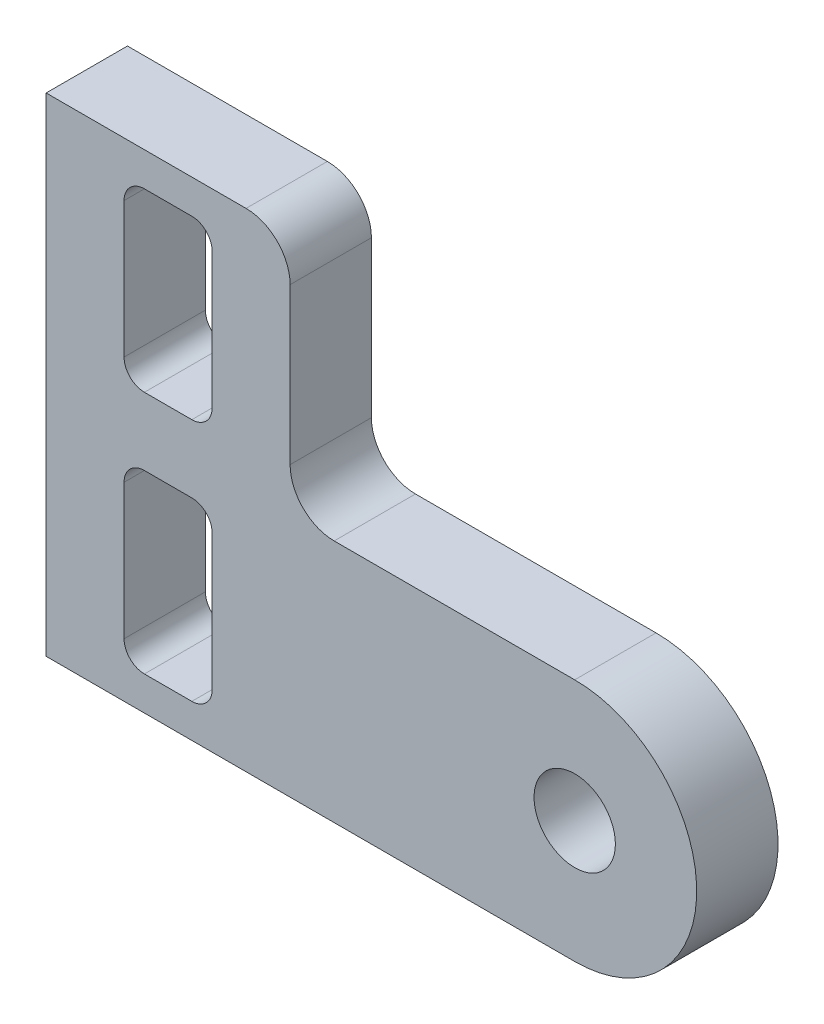
ISO-10303-21;
HEADER;
FILE_DESCRIPTION(('STEP AP214'),'2;1');
FILE_NAME('part.step','',(''),(''),'','','');
FILE_SCHEMA(('AUTOMOTIVE_DESIGN { 1 0 10303 214 1 1 1 1 }'));
ENDSEC;
DATA;
#1=APPLICATION_CONTEXT('core data for automotive mechanical design processes');
#2=APPLICATION_PROTOCOL_DEFINITION('international standard','automotive_design',2000,#1);
#3=PRODUCT_CONTEXT('',#1,'mechanical');
#4=PRODUCT('Part','Part','',(#3));
#5=PRODUCT_RELATED_PRODUCT_CATEGORY('part','',(#4));
#6=PRODUCT_DEFINITION_FORMATION('','',#4);
#7=PRODUCT_DEFINITION_CONTEXT('part definition',#1,'design');
#8=PRODUCT_DEFINITION('design','',#6,#7);
#9=PRODUCT_DEFINITION_SHAPE('','',#8);
#10=(LENGTH_UNIT() NAMED_UNIT(*) SI_UNIT(.MILLI.,.METRE.));
#11=(NAMED_UNIT(*) PLANE_ANGLE_UNIT() SI_UNIT($,.RADIAN.));
#12=(NAMED_UNIT(*) SI_UNIT($,.STERADIAN.) SOLID_ANGLE_UNIT());
#13=UNCERTAINTY_MEASURE_WITH_UNIT(LENGTH_MEASURE(1.E-05),#10,'distance_accuracy_value','');
#14=(GEOMETRIC_REPRESENTATION_CONTEXT(3) GLOBAL_UNCERTAINTY_ASSIGNED_CONTEXT((#13)) GLOBAL_UNIT_ASSIGNED_CONTEXT((#10,
#11,#12)) REPRESENTATION_CONTEXT('',''));
#15=CARTESIAN_POINT('',(0.,0.,0.));
#16=DIRECTION('',(0.,0.,1.));
#17=DIRECTION('',(1.,0.,0.));
#18=AXIS2_PLACEMENT_3D('',#15,#16,#17);
#19=CARTESIAN_POINT('',(201.0978533093,269.1465473352,3.));
#20=DIRECTION('',(0.,0.,1.));
#21=DIRECTION('',(1.,0.,0.));
#22=AXIS2_PLACEMENT_3D('',#19,#20,#21);
#23=PLANE('',#22);
#24=DIRECTION('',(1.,0.,0.));
#25=VECTOR('',#24,1.);
#26=CARTESIAN_POINT('',(185.2228533093,265.8965473352,3.));
#27=LINE('',#26,#25);
#28=CARTESIAN_POINT('',(185.2228533093,265.8965473352,3.));
#29=VERTEX_POINT('',#28);
#30=CARTESIAN_POINT('',(186.9728533093,265.8965473352,3.));
#31=VERTEX_POINT('',#30);
#32=EDGE_CURVE('E261',#29,#31,#27,.T.);
#33=ORIENTED_EDGE('',*,*,#32,.F.);
#34=CARTESIAN_POINT('',(185.2228533093,266.6465473352,3.));
#35=DIRECTION('',(0.,0.,1.));
#36=DIRECTION('',(1.,0.,0.));
#37=AXIS2_PLACEMENT_3D('',#34,#35,#36);
#38=CIRCLE('',#37,0.749999999999987);
#39=CARTESIAN_POINT('',(184.4728533093,266.6465473352,3.));
#40=VERTEX_POINT('',#39);
#41=EDGE_CURVE('E259',#40,#29,#38,.T.);
#42=ORIENTED_EDGE('',*,*,#41,.F.);
#43=DIRECTION('',(0.,-1.,0.));
#44=VECTOR('',#43,1.);
#45=CARTESIAN_POINT('',(184.4728533093,271.6465473352,3.));
#46=LINE('',#45,#44);
#47=CARTESIAN_POINT('',(184.4728533093,271.6465473352,3.));
#48=VERTEX_POINT('',#47);
#49=EDGE_CURVE('E275',#48,#40,#46,.T.);
#50=ORIENTED_EDGE('',*,*,#49,.F.);
#51=CARTESIAN_POINT('',(185.2228533093,271.6465473352,3.));
#52=DIRECTION('',(0.,0.,1.));
#53=DIRECTION('',(1.,0.,0.));
#54=AXIS2_PLACEMENT_3D('',#51,#52,#53);
#55=CIRCLE('',#54,0.750000000000015);
#56=CARTESIAN_POINT('',(185.2228533093,272.3965473352,3.));
#57=VERTEX_POINT('',#56);
#58=EDGE_CURVE('E272',#57,#48,#55,.T.);
#59=ORIENTED_EDGE('',*,*,#58,.F.);
#60=DIRECTION('',(-1.,0.,0.));
#61=VECTOR('',#60,1.);
#62=CARTESIAN_POINT('',(186.9728533093,272.3965473352,3.));
#63=LINE('',#62,#61);
#64=CARTESIAN_POINT('',(186.9728533093,272.3965473352,3.));
#65=VERTEX_POINT('',#64);
#66=EDGE_CURVE('E270',#65,#57,#63,.T.);
#67=ORIENTED_EDGE('',*,*,#66,.F.);
#68=CARTESIAN_POINT('',(186.9728533093,271.6465473352,3.));
#69=DIRECTION('',(0.,0.,1.));
#70=DIRECTION('',(1.,0.,0.));
#71=AXIS2_PLACEMENT_3D('',#68,#69,#70);
#72=CIRCLE('',#71,0.750000000000001);
#73=CARTESIAN_POINT('',(187.7228533093,271.6465473352,3.));
#74=VERTEX_POINT('',#73);
#75=EDGE_CURVE('E268',#74,#65,#72,.T.);
#76=ORIENTED_EDGE('',*,*,#75,.F.);
#77=DIRECTION('',(0.,1.,0.));
#78=VECTOR('',#77,1.);
#79=CARTESIAN_POINT('',(187.7228533093,266.6465473352,3.));
#80=LINE('',#79,#78);
#81=CARTESIAN_POINT('',(187.7228533093,266.6465473352,3.));
#82=VERTEX_POINT('',#81);
#83=EDGE_CURVE('E266',#82,#74,#80,.T.);
#84=ORIENTED_EDGE('',*,*,#83,.F.);
#85=CARTESIAN_POINT('',(186.9728533093,266.6465473352,3.));
#86=DIRECTION('',(0.,0.,1.));
#87=DIRECTION('',(1.,0.,0.));
#88=AXIS2_PLACEMENT_3D('',#85,#86,#87);
#89=CIRCLE('',#88,0.749999999999973);
#90=EDGE_CURVE('E264',#31,#82,#89,.T.);
#91=ORIENTED_EDGE('',*,*,#90,.F.);
#92=EDGE_LOOP('',(#33,#42,#50,#59,#67,#76,#84,#91));
#93=FACE_BOUND('',#92,.T.);
#94=CARTESIAN_POINT('',(201.0978533093,269.1465473352,3.));
#95=DIRECTION('',(0.,0.,1.));
#96=DIRECTION('',(1.,0.,0.));
#97=AXIS2_PLACEMENT_3D('',#94,#95,#96);
#98=CIRCLE('',#97,4.49999999999998);
#99=CARTESIAN_POINT('',(201.0978533093,264.6465473352,3.));
#100=VERTEX_POINT('',#99);
#101=CARTESIAN_POINT('',(201.0978533093,273.6465473352,3.));
#102=VERTEX_POINT('',#101);
#103=EDGE_CURVE('E324',#100,#102,#98,.T.);
#104=ORIENTED_EDGE('',*,*,#103,.T.);
#105=DIRECTION('',(-1.,0.,0.));
#106=VECTOR('',#105,1.);
#107=CARTESIAN_POINT('',(201.0978533093,273.6465473352,3.));
#108=LINE('',#107,#106);
#109=CARTESIAN_POINT('',(192.2228533093,273.6465473352,3.));
#110=VERTEX_POINT('',#109);
#111=EDGE_CURVE('E327',#102,#110,#108,.T.);
#112=ORIENTED_EDGE('',*,*,#111,.T.);
#113=CARTESIAN_POINT('',(192.2228533093,275.2715473352,3.));
#114=DIRECTION('',(0.,0.,-1.));
#115=DIRECTION('',(1.,0.,0.));
#116=AXIS2_PLACEMENT_3D('',#113,#114,#115);
#117=CIRCLE('',#116,1.62500000000002);
#118=CARTESIAN_POINT('',(190.5978533093,275.2715473352,3.));
#119=VERTEX_POINT('',#118);
#120=EDGE_CURVE('E330',#110,#119,#117,.T.);
#121=ORIENTED_EDGE('',*,*,#120,.T.);
#122=DIRECTION('',(0.,1.,0.));
#123=VECTOR('',#122,1.);
#124=CARTESIAN_POINT('',(190.5978533093,281.0215473352,3.));
#125=LINE('',#124,#123);
#126=CARTESIAN_POINT('',(190.5978533093,281.0215473352,3.));
#127=VERTEX_POINT('',#126);
#128=EDGE_CURVE('E332',#119,#127,#125,.T.);
#129=ORIENTED_EDGE('',*,*,#128,.T.);
#130=CARTESIAN_POINT('',(188.9728533093,281.0215473352,3.));
#131=DIRECTION('',(0.,0.,1.));
#132=DIRECTION('',(1.,0.,0.));
#133=AXIS2_PLACEMENT_3D('',#130,#131,#132);
#134=CIRCLE('',#133,1.625);
#135=CARTESIAN_POINT('',(188.9728533093,282.6465473352,3.));
#136=VERTEX_POINT('',#135);
#137=EDGE_CURVE('E334',#127,#136,#134,.T.);
#138=ORIENTED_EDGE('',*,*,#137,.T.);
#139=DIRECTION('',(-1.,0.,0.));
#140=VECTOR('',#139,1.);
#141=CARTESIAN_POINT('',(188.9728533093,282.6465473352,3.));
#142=LINE('',#141,#140);
#143=CARTESIAN_POINT('',(181.5978533093,282.6465473352,3.));
#144=VERTEX_POINT('',#143);
#145=EDGE_CURVE('E336',#136,#144,#142,.T.);
#146=ORIENTED_EDGE('',*,*,#145,.T.);
#147=DIRECTION('',(0.,-1.,0.));
#148=VECTOR('',#147,1.);
#149=CARTESIAN_POINT('',(181.5978533093,282.6465473352,3.));
#150=LINE('',#149,#148);
#151=CARTESIAN_POINT('',(181.5978533093,264.6465473352,3.));
#152=VERTEX_POINT('',#151);
#153=EDGE_CURVE('E338',#144,#152,#150,.T.);
#154=ORIENTED_EDGE('',*,*,#153,.T.);
#155=DIRECTION('',(1.,0.,0.));
#156=VECTOR('',#155,1.);
#157=CARTESIAN_POINT('',(201.0978533093,264.6465473352,3.));
#158=LINE('',#157,#156);
#159=EDGE_CURVE('E340',#152,#100,#158,.T.);
#160=ORIENTED_EDGE('',*,*,#159,.T.);
#161=EDGE_LOOP('',(#104,#112,#121,#129,#138,#146,#154,#160));
#162=FACE_BOUND('',#161,.T.);
#163=CARTESIAN_POINT('',(201.0978533093,269.1465473352,3.));
#164=DIRECTION('',(0.,0.,1.));
#165=DIRECTION('',(1.,0.,0.));
#166=AXIS2_PLACEMENT_3D('',#163,#164,#165);
#167=CIRCLE('',#166,1.5);
#168=CARTESIAN_POINT('',(202.5978533093,269.1465473352,3.));
#169=VERTEX_POINT('',#168);
#170=EDGE_CURVE('E318',#169,#169,#167,.T.);
#171=ORIENTED_EDGE('',*,*,#170,.F.);
#172=EDGE_LOOP('',(#171));
#173=FACE_BOUND('',#172,.T.);
#174=DIRECTION('',(1.,0.,0.));
#175=VECTOR('',#174,1.);
#176=CARTESIAN_POINT('',(185.2228533093,274.8959687639,3.));
#177=LINE('',#176,#175);
#178=CARTESIAN_POINT('',(185.2228533093,274.8959687639,3.));
#179=VERTEX_POINT('',#178);
#180=CARTESIAN_POINT('',(186.9728533093,274.8959687639,3.));
#181=VERTEX_POINT('',#180);
#182=EDGE_CURVE('E202',#179,#181,#177,.T.);
#183=ORIENTED_EDGE('',*,*,#182,.F.);
#184=CARTESIAN_POINT('',(185.2228533093,275.6459687639,3.));
#185=DIRECTION('',(0.,0.,1.));
#186=DIRECTION('',(1.,0.,0.));
#187=AXIS2_PLACEMENT_3D('',#184,#185,#186);
#188=CIRCLE('',#187,0.750000000000015);
#189=CARTESIAN_POINT('',(184.4728533093,275.6459687639,3.));
#190=VERTEX_POINT('',#189);
#191=EDGE_CURVE('E194',#190,#179,#188,.T.);
#192=ORIENTED_EDGE('',*,*,#191,.F.);
#193=DIRECTION('',(0.,-1.,0.));
#194=VECTOR('',#193,1.);
#195=CARTESIAN_POINT('',(184.4728533093,280.6459687639,3.));
#196=LINE('',#195,#194);
#197=CARTESIAN_POINT('',(184.4728533093,280.6459687639,3.));
#198=VERTEX_POINT('',#197);
#199=EDGE_CURVE('E227',#198,#190,#196,.T.);
#200=ORIENTED_EDGE('',*,*,#199,.F.);
#201=CARTESIAN_POINT('',(185.2228533093,280.6459687639,3.));
#202=DIRECTION('',(0.,0.,1.));
#203=DIRECTION('',(1.,0.,0.));
#204=AXIS2_PLACEMENT_3D('',#201,#202,#203);
#205=CIRCLE('',#204,0.750000000000015);
#206=CARTESIAN_POINT('',(185.2228533093,281.3959687639,3.));
#207=VERTEX_POINT('',#206);
#208=EDGE_CURVE('E225',#207,#198,#205,.T.);
#209=ORIENTED_EDGE('',*,*,#208,.F.);
#210=DIRECTION('',(-1.,0.,0.));
#211=VECTOR('',#210,1.);
#212=CARTESIAN_POINT('',(186.9728533093,281.3959687639,3.));
#213=LINE('',#212,#211);
#214=CARTESIAN_POINT('',(186.9728533093,281.3959687639,3.));
#215=VERTEX_POINT('',#214);
#216=EDGE_CURVE('E223',#215,#207,#213,.T.);
#217=ORIENTED_EDGE('',*,*,#216,.F.);
#218=CARTESIAN_POINT('',(186.9728533093,280.6459687639,3.));
#219=DIRECTION('',(0.,0.,1.));
#220=DIRECTION('',(1.,0.,0.));
#221=AXIS2_PLACEMENT_3D('',#218,#219,#220);
#222=CIRCLE('',#221,0.750000000000001);
#223=CARTESIAN_POINT('',(187.7228533093,280.6459687639,3.));
#224=VERTEX_POINT('',#223);
#225=EDGE_CURVE('E221',#224,#215,#222,.T.);
#226=ORIENTED_EDGE('',*,*,#225,.F.);
#227=DIRECTION('',(0.,1.,0.));
#228=VECTOR('',#227,1.);
#229=CARTESIAN_POINT('',(187.7228533093,275.6459687639,3.));
#230=LINE('',#229,#228);
#231=CARTESIAN_POINT('',(187.7228533093,275.6459687639,3.));
#232=VERTEX_POINT('',#231);
#233=EDGE_CURVE('E217',#232,#224,#230,.T.);
#234=ORIENTED_EDGE('',*,*,#233,.F.);
#235=CARTESIAN_POINT('',(186.9728533093,275.6459687639,3.));
#236=DIRECTION('',(0.,0.,1.));
#237=DIRECTION('',(1.,0.,0.));
#238=AXIS2_PLACEMENT_3D('',#235,#236,#237);
#239=CIRCLE('',#238,0.750000000000001);
#240=EDGE_CURVE('E215',#181,#232,#239,.T.);
#241=ORIENTED_EDGE('',*,*,#240,.F.);
#242=EDGE_LOOP('',(#183,#192,#200,#209,#217,#226,#234,#241));
#243=FACE_BOUND('',#242,.T.);
#244=ADVANCED_FACE('F33',(#93,#162,#173,#243),#23,.T.);
#245=CARTESIAN_POINT('',(201.0978533093,269.1465473352,0.));
#246=DIRECTION('',(0.,0.,1.));
#247=DIRECTION('',(1.,0.,0.));
#248=AXIS2_PLACEMENT_3D('',#245,#246,#247);
#249=PLANE('',#248);
#250=CARTESIAN_POINT('',(185.2228533093,266.6465473352,0.));
#251=DIRECTION('',(0.,0.,1.));
#252=DIRECTION('',(1.,0.,0.));
#253=AXIS2_PLACEMENT_3D('',#250,#251,#252);
#254=CIRCLE('',#253,0.749999999999987);
#255=CARTESIAN_POINT('',(184.4728533093,266.6465473352,0.));
#256=VERTEX_POINT('',#255);
#257=CARTESIAN_POINT('',(185.2228533093,265.8965473352,0.));
#258=VERTEX_POINT('',#257);
#259=EDGE_CURVE('E210',#256,#258,#254,.T.);
#260=ORIENTED_EDGE('',*,*,#259,.T.);
#261=DIRECTION('',(1.,0.,0.));
#262=VECTOR('',#261,1.);
#263=CARTESIAN_POINT('',(185.2228533093,265.8965473352,0.));
#264=LINE('',#263,#262);
#265=CARTESIAN_POINT('',(186.9728533093,265.8965473352,0.));
#266=VERTEX_POINT('',#265);
#267=EDGE_CURVE('E280',#258,#266,#264,.T.);
#268=ORIENTED_EDGE('',*,*,#267,.T.);
#269=CARTESIAN_POINT('',(186.9728533093,266.6465473352,0.));
#270=DIRECTION('',(0.,0.,1.));
#271=DIRECTION('',(1.,0.,0.));
#272=AXIS2_PLACEMENT_3D('',#269,#270,#271);
#273=CIRCLE('',#272,0.749999999999973);
#274=CARTESIAN_POINT('',(187.7228533093,266.6465473352,0.));
#275=VERTEX_POINT('',#274);
#276=EDGE_CURVE('E283',#266,#275,#273,.T.);
#277=ORIENTED_EDGE('',*,*,#276,.T.);
#278=DIRECTION('',(0.,1.,0.));
#279=VECTOR('',#278,1.);
#280=CARTESIAN_POINT('',(187.7228533093,266.6465473352,0.));
#281=LINE('',#280,#279);
#282=CARTESIAN_POINT('',(187.7228533093,271.6465473352,0.));
#283=VERTEX_POINT('',#282);
#284=EDGE_CURVE('E286',#275,#283,#281,.T.);
#285=ORIENTED_EDGE('',*,*,#284,.T.);
#286=CARTESIAN_POINT('',(186.9728533093,271.6465473352,0.));
#287=DIRECTION('',(0.,0.,1.));
#288=DIRECTION('',(1.,0.,0.));
#289=AXIS2_PLACEMENT_3D('',#286,#287,#288);
#290=CIRCLE('',#289,0.750000000000001);
#291=CARTESIAN_POINT('',(186.9728533093,272.3965473352,0.));
#292=VERTEX_POINT('',#291);
#293=EDGE_CURVE('E289',#283,#292,#290,.T.);
#294=ORIENTED_EDGE('',*,*,#293,.T.);
#295=DIRECTION('',(-1.,0.,0.));
#296=VECTOR('',#295,1.);
#297=CARTESIAN_POINT('',(186.9728533093,272.3965473352,0.));
#298=LINE('',#297,#296);
#299=CARTESIAN_POINT('',(185.2228533093,272.3965473352,0.));
#300=VERTEX_POINT('',#299);
#301=EDGE_CURVE('E292',#292,#300,#298,.T.);
#302=ORIENTED_EDGE('',*,*,#301,.T.);
#303=CARTESIAN_POINT('',(185.2228533093,271.6465473352,0.));
#304=DIRECTION('',(0.,0.,1.));
#305=DIRECTION('',(1.,0.,0.));
#306=AXIS2_PLACEMENT_3D('',#303,#304,#305);
#307=CIRCLE('',#306,0.750000000000015);
#308=CARTESIAN_POINT('',(184.4728533093,271.6465473352,0.));
#309=VERTEX_POINT('',#308);
#310=EDGE_CURVE('E295',#300,#309,#307,.T.);
#311=ORIENTED_EDGE('',*,*,#310,.T.);
#312=DIRECTION('',(0.,-1.,0.));
#313=VECTOR('',#312,1.);
#314=CARTESIAN_POINT('',(184.4728533093,271.6465473352,0.));
#315=LINE('',#314,#313);
#316=EDGE_CURVE('E262',#309,#256,#315,.T.);
#317=ORIENTED_EDGE('',*,*,#316,.T.);
#318=EDGE_LOOP('',(#260,#268,#277,#285,#294,#302,#311,#317));
#319=FACE_BOUND('',#318,.T.);
#320=CARTESIAN_POINT('',(201.0978533093,269.1465473352,0.));
#321=DIRECTION('',(0.,0.,1.));
#322=DIRECTION('',(1.,0.,0.));
#323=AXIS2_PLACEMENT_3D('',#320,#321,#322);
#324=CIRCLE('',#323,4.49999999999998);
#325=CARTESIAN_POINT('',(201.0978533093,264.6465473352,0.));
#326=VERTEX_POINT('',#325);
#327=CARTESIAN_POINT('',(201.0978533093,273.6465473352,0.));
#328=VERTEX_POINT('',#327);
#329=EDGE_CURVE('E321',#326,#328,#324,.T.);
#330=ORIENTED_EDGE('',*,*,#329,.F.);
#331=DIRECTION('',(1.,0.,0.));
#332=VECTOR('',#331,1.);
#333=CARTESIAN_POINT('',(201.0978533093,264.6465473352,0.));
#334=LINE('',#333,#332);
#335=CARTESIAN_POINT('',(181.5978533093,264.6465473352,0.));
#336=VERTEX_POINT('',#335);
#337=EDGE_CURVE('E328',#336,#326,#334,.T.);
#338=ORIENTED_EDGE('',*,*,#337,.F.);
#339=DIRECTION('',(0.,-1.,0.));
#340=VECTOR('',#339,1.);
#341=CARTESIAN_POINT('',(181.5978533093,282.6465473352,0.));
#342=LINE('',#341,#340);
#343=CARTESIAN_POINT('',(181.5978533093,282.6465473352,0.));
#344=VERTEX_POINT('',#343);
#345=EDGE_CURVE('E355',#344,#336,#342,.T.);
#346=ORIENTED_EDGE('',*,*,#345,.F.);
#347=DIRECTION('',(-1.,0.,0.));
#348=VECTOR('',#347,1.);
#349=CARTESIAN_POINT('',(188.9728533093,282.6465473352,0.));
#350=LINE('',#349,#348);
#351=CARTESIAN_POINT('',(188.9728533093,282.6465473352,0.));
#352=VERTEX_POINT('',#351);
#353=EDGE_CURVE('E353',#352,#344,#350,.T.);
#354=ORIENTED_EDGE('',*,*,#353,.F.);
#355=CARTESIAN_POINT('',(188.9728533093,281.0215473352,0.));
#356=DIRECTION('',(0.,0.,1.));
#357=DIRECTION('',(1.,0.,0.));
#358=AXIS2_PLACEMENT_3D('',#355,#356,#357);
#359=CIRCLE('',#358,1.625);
#360=CARTESIAN_POINT('',(190.5978533093,281.0215473352,0.));
#361=VERTEX_POINT('',#360);
#362=EDGE_CURVE('E351',#361,#352,#359,.T.);
#363=ORIENTED_EDGE('',*,*,#362,.F.);
#364=DIRECTION('',(0.,1.,0.));
#365=VECTOR('',#364,1.);
#366=CARTESIAN_POINT('',(190.5978533093,281.0215473352,0.));
#367=LINE('',#366,#365);
#368=CARTESIAN_POINT('',(190.5978533093,275.2715473352,0.));
#369=VERTEX_POINT('',#368);
#370=EDGE_CURVE('E349',#369,#361,#367,.T.);
#371=ORIENTED_EDGE('',*,*,#370,.F.);
#372=CARTESIAN_POINT('',(192.2228533093,275.2715473352,0.));
#373=DIRECTION('',(0.,0.,-1.));
#374=DIRECTION('',(1.,0.,0.));
#375=AXIS2_PLACEMENT_3D('',#372,#373,#374);
#376=CIRCLE('',#375,1.62500000000002);
#377=CARTESIAN_POINT('',(192.2228533093,273.6465473352,0.));
#378=VERTEX_POINT('',#377);
#379=EDGE_CURVE('E347',#378,#369,#376,.T.);
#380=ORIENTED_EDGE('',*,*,#379,.F.);
#381=DIRECTION('',(-1.,0.,0.));
#382=VECTOR('',#381,1.);
#383=CARTESIAN_POINT('',(201.0978533093,273.6465473352,0.));
#384=LINE('',#383,#382);
#385=EDGE_CURVE('E345',#328,#378,#384,.T.);
#386=ORIENTED_EDGE('',*,*,#385,.F.);
#387=EDGE_LOOP('',(#330,#338,#346,#354,#363,#371,#380,#386));
#388=FACE_BOUND('',#387,.T.);
#389=CARTESIAN_POINT('',(201.0978533093,269.1465473352,0.));
#390=DIRECTION('',(0.,0.,1.));
#391=DIRECTION('',(1.,0.,0.));
#392=AXIS2_PLACEMENT_3D('',#389,#390,#391);
#393=CIRCLE('',#392,1.5);
#394=CARTESIAN_POINT('',(202.5978533093,269.1465473352,0.));
#395=VERTEX_POINT('',#394);
#396=EDGE_CURVE('E317',#395,#395,#393,.T.);
#397=ORIENTED_EDGE('',*,*,#396,.T.);
#398=EDGE_LOOP('',(#397));
#399=FACE_BOUND('',#398,.T.);
#400=CARTESIAN_POINT('',(185.2228533093,275.6459687639,0.));
#401=DIRECTION('',(0.,0.,1.));
#402=DIRECTION('',(1.,0.,0.));
#403=AXIS2_PLACEMENT_3D('',#400,#401,#402);
#404=CIRCLE('',#403,0.750000000000015);
#405=CARTESIAN_POINT('',(184.4728533093,275.6459687639,0.));
#406=VERTEX_POINT('',#405);
#407=CARTESIAN_POINT('',(185.2228533093,274.8959687639,0.));
#408=VERTEX_POINT('',#407);
#409=EDGE_CURVE('E56',#406,#408,#404,.T.);
#410=ORIENTED_EDGE('',*,*,#409,.T.);
#411=DIRECTION('',(1.,0.,0.));
#412=VECTOR('',#411,1.);
#413=CARTESIAN_POINT('',(185.2228533093,274.8959687639,0.));
#414=LINE('',#413,#412);
#415=CARTESIAN_POINT('',(186.9728533093,274.8959687639,0.));
#416=VERTEX_POINT('',#415);
#417=EDGE_CURVE('E209',#408,#416,#414,.T.);
#418=ORIENTED_EDGE('',*,*,#417,.T.);
#419=CARTESIAN_POINT('',(186.9728533093,275.6459687639,0.));
#420=DIRECTION('',(0.,0.,1.));
#421=DIRECTION('',(1.,0.,0.));
#422=AXIS2_PLACEMENT_3D('',#419,#420,#421);
#423=CIRCLE('',#422,0.750000000000001);
#424=CARTESIAN_POINT('',(187.7228533093,275.6459687639,0.));
#425=VERTEX_POINT('',#424);
#426=EDGE_CURVE('E231',#416,#425,#423,.T.);
#427=ORIENTED_EDGE('',*,*,#426,.T.);
#428=DIRECTION('',(0.,1.,0.));
#429=VECTOR('',#428,1.);
#430=CARTESIAN_POINT('',(187.7228533093,275.6459687639,0.));
#431=LINE('',#430,#429);
#432=CARTESIAN_POINT('',(187.7228533093,280.6459687639,0.));
#433=VERTEX_POINT('',#432);
#434=EDGE_CURVE('E234',#425,#433,#431,.T.);
#435=ORIENTED_EDGE('',*,*,#434,.T.);
#436=CARTESIAN_POINT('',(186.9728533093,280.6459687639,0.));
#437=DIRECTION('',(0.,0.,1.));
#438=DIRECTION('',(1.,0.,0.));
#439=AXIS2_PLACEMENT_3D('',#436,#437,#438);
#440=CIRCLE('',#439,0.750000000000001);
#441=CARTESIAN_POINT('',(186.9728533093,281.3959687639,0.));
#442=VERTEX_POINT('',#441);
#443=EDGE_CURVE('E237',#433,#442,#440,.T.);
#444=ORIENTED_EDGE('',*,*,#443,.T.);
#445=DIRECTION('',(-1.,0.,0.));
#446=VECTOR('',#445,1.);
#447=CARTESIAN_POINT('',(186.9728533093,281.3959687639,0.));
#448=LINE('',#447,#446);
#449=CARTESIAN_POINT('',(185.2228533093,281.3959687639,0.));
#450=VERTEX_POINT('',#449);
#451=EDGE_CURVE('E240',#442,#450,#448,.T.);
#452=ORIENTED_EDGE('',*,*,#451,.T.);
#453=CARTESIAN_POINT('',(185.2228533093,280.6459687639,0.));
#454=DIRECTION('',(0.,0.,1.));
#455=DIRECTION('',(1.,0.,0.));
#456=AXIS2_PLACEMENT_3D('',#453,#454,#455);
#457=CIRCLE('',#456,0.750000000000015);
#458=CARTESIAN_POINT('',(184.4728533093,280.6459687639,0.));
#459=VERTEX_POINT('',#458);
#460=EDGE_CURVE('E243',#450,#459,#457,.T.);
#461=ORIENTED_EDGE('',*,*,#460,.T.);
#462=DIRECTION('',(0.,-1.,0.));
#463=VECTOR('',#462,1.);
#464=CARTESIAN_POINT('',(184.4728533093,280.6459687639,0.));
#465=LINE('',#464,#463);
#466=EDGE_CURVE('E203',#459,#406,#465,.T.);
#467=ORIENTED_EDGE('',*,*,#466,.T.);
#468=EDGE_LOOP('',(#410,#418,#427,#435,#444,#452,#461,#467));
#469=FACE_BOUND('',#468,.T.);
#470=ADVANCED_FACE('F385',(#319,#388,#399,#469),#249,.F.);
#471=CARTESIAN_POINT('',(201.0978533093,269.1465473352,3.));
#472=DIRECTION('',(0.,0.,-1.));
#473=DIRECTION('',(-1.,0.,0.));
#474=AXIS2_PLACEMENT_3D('',#471,#472,#473);
#475=CYLINDRICAL_SURFACE('',#474,4.49999999999998);
#476=ORIENTED_EDGE('',*,*,#329,.T.);
#477=DIRECTION('',(0.,0.,-1.));
#478=VECTOR('',#477,1.);
#479=CARTESIAN_POINT('',(201.0978533093,273.6465473352,3.));
#480=LINE('',#479,#478);
#481=EDGE_CURVE('E11',#102,#328,#480,.T.);
#482=ORIENTED_EDGE('',*,*,#481,.F.);
#483=ORIENTED_EDGE('',*,*,#103,.F.);
#484=DIRECTION('',(0.,0.,-1.));
#485=VECTOR('',#484,1.);
#486=CARTESIAN_POINT('',(201.0978533093,264.6465473352,3.));
#487=LINE('',#486,#485);
#488=EDGE_CURVE('E342',#100,#326,#487,.T.);
#489=ORIENTED_EDGE('',*,*,#488,.T.);
#490=EDGE_LOOP('',(#476,#482,#483,#489));
#491=FACE_BOUND('',#490,.T.);
#492=ADVANCED_FACE('F35',(#491),#475,.T.);
#493=CARTESIAN_POINT('',(201.0978533093,273.6465473352,3.));
#494=DIRECTION('',(0.,-1.,0.));
#495=DIRECTION('',(0.,0.,-1.));
#496=AXIS2_PLACEMENT_3D('',#493,#494,#495);
#497=PLANE('',#496);
#498=ORIENTED_EDGE('',*,*,#385,.T.);
#499=DIRECTION('',(0.,0.,-1.));
#500=VECTOR('',#499,1.);
#501=CARTESIAN_POINT('',(192.2228533093,273.6465473352,3.));
#502=LINE('',#501,#500);
#503=EDGE_CURVE('E41',#110,#378,#502,.T.);
#504=ORIENTED_EDGE('',*,*,#503,.F.);
#505=ORIENTED_EDGE('',*,*,#111,.F.);
#506=ORIENTED_EDGE('',*,*,#481,.T.);
#507=EDGE_LOOP('',(#498,#504,#505,#506));
#508=FACE_BOUND('',#507,.T.);
#509=ADVANCED_FACE('F403',(#508),#497,.F.);
#510=CARTESIAN_POINT('',(192.2228533093,275.2715473352,3.));
#511=DIRECTION('',(0.,0.,-1.));
#512=DIRECTION('',(-1.,0.,0.));
#513=AXIS2_PLACEMENT_3D('',#510,#511,#512);
#514=CYLINDRICAL_SURFACE('',#513,1.62500000000002);
#515=ORIENTED_EDGE('',*,*,#379,.T.);
#516=DIRECTION('',(0.,0.,-1.));
#517=VECTOR('',#516,1.);
#518=CARTESIAN_POINT('',(190.5978533093,275.2715473352,3.));
#519=LINE('',#518,#517);
#520=EDGE_CURVE('E372',#119,#369,#519,.T.);
#521=ORIENTED_EDGE('',*,*,#520,.F.);
#522=ORIENTED_EDGE('',*,*,#120,.F.);
#523=ORIENTED_EDGE('',*,*,#503,.T.);
#524=EDGE_LOOP('',(#515,#521,#522,#523));
#525=FACE_BOUND('',#524,.T.);
#526=ADVANCED_FACE('F379',(#525),#514,.F.);
#527=CARTESIAN_POINT('',(190.5978533093,281.0215473352,3.));
#528=DIRECTION('',(-1.,0.,0.));
#529=DIRECTION('',(0.,0.,1.));
#530=AXIS2_PLACEMENT_3D('',#527,#528,#529);
#531=PLANE('',#530);
#532=ORIENTED_EDGE('',*,*,#370,.T.);
#533=DIRECTION('',(0.,0.,-1.));
#534=VECTOR('',#533,1.);
#535=CARTESIAN_POINT('',(190.5978533093,281.0215473352,3.));
#536=LINE('',#535,#534);
#537=EDGE_CURVE('E369',#127,#361,#536,.T.);
#538=ORIENTED_EDGE('',*,*,#537,.F.);
#539=ORIENTED_EDGE('',*,*,#128,.F.);
#540=ORIENTED_EDGE('',*,*,#520,.T.);
#541=EDGE_LOOP('',(#532,#538,#539,#540));
#542=FACE_BOUND('',#541,.T.);
#543=ADVANCED_FACE('F391',(#542),#531,.F.);
#544=CARTESIAN_POINT('',(188.9728533093,281.0215473352,3.));
#545=DIRECTION('',(0.,0.,-1.));
#546=DIRECTION('',(-1.,0.,0.));
#547=AXIS2_PLACEMENT_3D('',#544,#545,#546);
#548=CYLINDRICAL_SURFACE('',#547,1.625);
#549=ORIENTED_EDGE('',*,*,#362,.T.);
#550=DIRECTION('',(0.,0.,-1.));
#551=VECTOR('',#550,1.);
#552=CARTESIAN_POINT('',(188.9728533093,282.6465473352,3.));
#553=LINE('',#552,#551);
#554=EDGE_CURVE('E366',#136,#352,#553,.T.);
#555=ORIENTED_EDGE('',*,*,#554,.F.);
#556=ORIENTED_EDGE('',*,*,#137,.F.);
#557=ORIENTED_EDGE('',*,*,#537,.T.);
#558=EDGE_LOOP('',(#549,#555,#556,#557));
#559=FACE_BOUND('',#558,.T.);
#560=ADVANCED_FACE('F395',(#559),#548,.T.);
#561=CARTESIAN_POINT('',(188.9728533093,282.6465473352,3.));
#562=DIRECTION('',(0.,-1.,0.));
#563=DIRECTION('',(0.,0.,-1.));
#564=AXIS2_PLACEMENT_3D('',#561,#562,#563);
#565=PLANE('',#564);
#566=ORIENTED_EDGE('',*,*,#353,.T.);
#567=DIRECTION('',(0.,0.,-1.));
#568=VECTOR('',#567,1.);
#569=CARTESIAN_POINT('',(181.5978533093,282.6465473352,3.));
#570=LINE('',#569,#568);
#571=EDGE_CURVE('E363',#144,#344,#570,.T.);
#572=ORIENTED_EDGE('',*,*,#571,.F.);
#573=ORIENTED_EDGE('',*,*,#145,.F.);
#574=ORIENTED_EDGE('',*,*,#554,.T.);
#575=EDGE_LOOP('',(#566,#572,#573,#574));
#576=FACE_BOUND('',#575,.T.);
#577=ADVANCED_FACE('F416',(#576),#565,.F.);
#578=CARTESIAN_POINT('',(181.5978533093,282.6465473352,3.));
#579=DIRECTION('',(1.,0.,0.));
#580=DIRECTION('',(0.,0.,-1.));
#581=AXIS2_PLACEMENT_3D('',#578,#579,#580);
#582=PLANE('',#581);
#583=ORIENTED_EDGE('',*,*,#345,.T.);
#584=DIRECTION('',(0.,0.,-1.));
#585=VECTOR('',#584,1.);
#586=CARTESIAN_POINT('',(181.5978533093,264.6465473352,3.));
#587=LINE('',#586,#585);
#588=EDGE_CURVE('E360',#152,#336,#587,.T.);
#589=ORIENTED_EDGE('',*,*,#588,.F.);
#590=ORIENTED_EDGE('',*,*,#153,.F.);
#591=ORIENTED_EDGE('',*,*,#571,.T.);
#592=EDGE_LOOP('',(#583,#589,#590,#591));
#593=FACE_BOUND('',#592,.T.);
#594=ADVANCED_FACE('F414',(#593),#582,.F.);
#595=CARTESIAN_POINT('',(201.0978533093,264.6465473352,3.));
#596=DIRECTION('',(0.,1.,0.));
#597=DIRECTION('',(0.,0.,1.));
#598=AXIS2_PLACEMENT_3D('',#595,#596,#597);
#599=PLANE('',#598);
#600=ORIENTED_EDGE('',*,*,#337,.T.);
#601=ORIENTED_EDGE('',*,*,#488,.F.);
#602=ORIENTED_EDGE('',*,*,#159,.F.);
#603=ORIENTED_EDGE('',*,*,#588,.T.);
#604=EDGE_LOOP('',(#600,#601,#602,#603));
#605=FACE_BOUND('',#604,.T.);
#606=ADVANCED_FACE('F409',(#605),#599,.F.);
#607=CARTESIAN_POINT('',(201.0978533093,269.1465473352,3.));
#608=DIRECTION('',(0.,0.,-1.));
#609=DIRECTION('',(-1.,0.,0.));
#610=AXIS2_PLACEMENT_3D('',#607,#608,#609);
#611=CYLINDRICAL_SURFACE('',#610,1.5);
#612=ORIENTED_EDGE('',*,*,#170,.T.);
#613=EDGE_LOOP('',(#612));
#614=FACE_BOUND('',#613,.T.);
#615=ORIENTED_EDGE('',*,*,#396,.F.);
#616=EDGE_LOOP('',(#615));
#617=FACE_BOUND('',#616,.T.);
#618=ADVANCED_FACE('F435',(#614,#617),#611,.F.);
#619=CARTESIAN_POINT('',(185.2228533093,266.6465473352,3.));
#620=DIRECTION('',(0.,0.,-1.));
#621=DIRECTION('',(-1.,0.,0.));
#622=AXIS2_PLACEMENT_3D('',#619,#620,#621);
#623=CYLINDRICAL_SURFACE('',#622,0.749999999999987);
#624=ORIENTED_EDGE('',*,*,#259,.F.);
#625=DIRECTION('',(0.,0.,-1.));
#626=VECTOR('',#625,1.);
#627=CARTESIAN_POINT('',(184.4728533093,266.6465473352,3.));
#628=LINE('',#627,#626);
#629=EDGE_CURVE('E277',#40,#256,#628,.T.);
#630=ORIENTED_EDGE('',*,*,#629,.F.);
#631=ORIENTED_EDGE('',*,*,#41,.T.);
#632=DIRECTION('',(0.,0.,-1.));
#633=VECTOR('',#632,1.);
#634=CARTESIAN_POINT('',(185.2228533093,265.8965473352,3.));
#635=LINE('',#634,#633);
#636=EDGE_CURVE('E314',#29,#258,#635,.T.);
#637=ORIENTED_EDGE('',*,*,#636,.T.);
#638=EDGE_LOOP('',(#624,#630,#631,#637));
#639=FACE_BOUND('',#638,.T.);
#640=ADVANCED_FACE('F442',(#639),#623,.F.);
#641=CARTESIAN_POINT('',(185.2228533093,265.8965473352,3.));
#642=DIRECTION('',(0.,1.,0.));
#643=DIRECTION('',(0.,0.,1.));
#644=AXIS2_PLACEMENT_3D('',#641,#642,#643);
#645=PLANE('',#644);
#646=ORIENTED_EDGE('',*,*,#267,.F.);
#647=ORIENTED_EDGE('',*,*,#636,.F.);
#648=ORIENTED_EDGE('',*,*,#32,.T.);
#649=DIRECTION('',(0.,0.,-1.));
#650=VECTOR('',#649,1.);
#651=CARTESIAN_POINT('',(186.9728533093,265.8965473352,3.));
#652=LINE('',#651,#650);
#653=EDGE_CURVE('E312',#31,#266,#652,.T.);
#654=ORIENTED_EDGE('',*,*,#653,.T.);
#655=EDGE_LOOP('',(#646,#647,#648,#654));
#656=FACE_BOUND('',#655,.T.);
#657=ADVANCED_FACE('F447',(#656),#645,.T.);
#658=CARTESIAN_POINT('',(186.9728533093,266.6465473352,3.));
#659=DIRECTION('',(0.,0.,-1.));
#660=DIRECTION('',(-1.,0.,0.));
#661=AXIS2_PLACEMENT_3D('',#658,#659,#660);
#662=CYLINDRICAL_SURFACE('',#661,0.749999999999973);
#663=ORIENTED_EDGE('',*,*,#276,.F.);
#664=ORIENTED_EDGE('',*,*,#653,.F.);
#665=ORIENTED_EDGE('',*,*,#90,.T.);
#666=DIRECTION('',(0.,0.,-1.));
#667=VECTOR('',#666,1.);
#668=CARTESIAN_POINT('',(187.7228533093,266.6465473352,3.));
#669=LINE('',#668,#667);
#670=EDGE_CURVE('E310',#82,#275,#669,.T.);
#671=ORIENTED_EDGE('',*,*,#670,.T.);
#672=EDGE_LOOP('',(#663,#664,#665,#671));
#673=FACE_BOUND('',#672,.T.);
#674=ADVANCED_FACE('F507',(#673),#662,.F.);
#675=CARTESIAN_POINT('',(187.7228533093,266.6465473352,3.));
#676=DIRECTION('',(-1.,0.,0.));
#677=DIRECTION('',(0.,0.,1.));
#678=AXIS2_PLACEMENT_3D('',#675,#676,#677);
#679=PLANE('',#678);
#680=ORIENTED_EDGE('',*,*,#284,.F.);
#681=ORIENTED_EDGE('',*,*,#670,.F.);
#682=ORIENTED_EDGE('',*,*,#83,.T.);
#683=DIRECTION('',(0.,0.,-1.));
#684=VECTOR('',#683,1.);
#685=CARTESIAN_POINT('',(187.7228533093,271.6465473352,3.));
#686=LINE('',#685,#684);
#687=EDGE_CURVE('E308',#74,#283,#686,.T.);
#688=ORIENTED_EDGE('',*,*,#687,.T.);
#689=EDGE_LOOP('',(#680,#681,#682,#688));
#690=FACE_BOUND('',#689,.T.);
#691=ADVANCED_FACE('F503',(#690),#679,.T.);
#692=CARTESIAN_POINT('',(186.9728533093,271.6465473352,3.));
#693=DIRECTION('',(0.,0.,-1.));
#694=DIRECTION('',(-1.,0.,0.));
#695=AXIS2_PLACEMENT_3D('',#692,#693,#694);
#696=CYLINDRICAL_SURFACE('',#695,0.750000000000001);
#697=ORIENTED_EDGE('',*,*,#293,.F.);
#698=ORIENTED_EDGE('',*,*,#687,.F.);
#699=ORIENTED_EDGE('',*,*,#75,.T.);
#700=DIRECTION('',(0.,0.,-1.));
#701=VECTOR('',#700,1.);
#702=CARTESIAN_POINT('',(186.9728533093,272.3965473352,3.));
#703=LINE('',#702,#701);
#704=EDGE_CURVE('E306',#65,#292,#703,.T.);
#705=ORIENTED_EDGE('',*,*,#704,.T.);
#706=EDGE_LOOP('',(#697,#698,#699,#705));
#707=FACE_BOUND('',#706,.T.);
#708=ADVANCED_FACE('F499',(#707),#696,.F.);
#709=CARTESIAN_POINT('',(186.9728533093,272.3965473352,3.));
#710=DIRECTION('',(0.,-1.,0.));
#711=DIRECTION('',(0.,0.,-1.));
#712=AXIS2_PLACEMENT_3D('',#709,#710,#711);
#713=PLANE('',#712);
#714=ORIENTED_EDGE('',*,*,#301,.F.);
#715=ORIENTED_EDGE('',*,*,#704,.F.);
#716=ORIENTED_EDGE('',*,*,#66,.T.);
#717=DIRECTION('',(0.,0.,-1.));
#718=VECTOR('',#717,1.);
#719=CARTESIAN_POINT('',(185.2228533093,272.3965473352,3.));
#720=LINE('',#719,#718);
#721=EDGE_CURVE('E304',#57,#300,#720,.T.);
#722=ORIENTED_EDGE('',*,*,#721,.T.);
#723=EDGE_LOOP('',(#714,#715,#716,#722));
#724=FACE_BOUND('',#723,.T.);
#725=ADVANCED_FACE('F495',(#724),#713,.T.);
#726=CARTESIAN_POINT('',(185.2228533093,271.6465473352,3.));
#727=DIRECTION('',(0.,0.,-1.));
#728=DIRECTION('',(-1.,0.,0.));
#729=AXIS2_PLACEMENT_3D('',#726,#727,#728);
#730=CYLINDRICAL_SURFACE('',#729,0.750000000000015);
#731=ORIENTED_EDGE('',*,*,#310,.F.);
#732=ORIENTED_EDGE('',*,*,#721,.F.);
#733=ORIENTED_EDGE('',*,*,#58,.T.);
#734=DIRECTION('',(0.,0.,-1.));
#735=VECTOR('',#734,1.);
#736=CARTESIAN_POINT('',(184.4728533093,271.6465473352,3.));
#737=LINE('',#736,#735);
#738=EDGE_CURVE('E302',#48,#309,#737,.T.);
#739=ORIENTED_EDGE('',*,*,#738,.T.);
#740=EDGE_LOOP('',(#731,#732,#733,#739));
#741=FACE_BOUND('',#740,.T.);
#742=ADVANCED_FACE('F491',(#741),#730,.F.);
#743=CARTESIAN_POINT('',(184.4728533093,271.6465473352,3.));
#744=DIRECTION('',(1.,0.,0.));
#745=DIRECTION('',(0.,0.,-1.));
#746=AXIS2_PLACEMENT_3D('',#743,#744,#745);
#747=PLANE('',#746);
#748=ORIENTED_EDGE('',*,*,#316,.F.);
#749=ORIENTED_EDGE('',*,*,#738,.F.);
#750=ORIENTED_EDGE('',*,*,#49,.T.);
#751=ORIENTED_EDGE('',*,*,#629,.T.);
#752=EDGE_LOOP('',(#748,#749,#750,#751));
#753=FACE_BOUND('',#752,.T.);
#754=ADVANCED_FACE('F488',(#753),#747,.T.);
#755=CARTESIAN_POINT('',(185.2228533093,275.6459687639,3.));
#756=DIRECTION('',(0.,0.,-1.));
#757=DIRECTION('',(-1.,0.,0.));
#758=AXIS2_PLACEMENT_3D('',#755,#756,#757);
#759=CYLINDRICAL_SURFACE('',#758,0.750000000000015);
#760=ORIENTED_EDGE('',*,*,#409,.F.);
#761=DIRECTION('',(0.,0.,-1.));
#762=VECTOR('',#761,1.);
#763=CARTESIAN_POINT('',(184.4728533093,275.6459687639,3.));
#764=LINE('',#763,#762);
#765=EDGE_CURVE('E198',#190,#406,#764,.T.);
#766=ORIENTED_EDGE('',*,*,#765,.F.);
#767=ORIENTED_EDGE('',*,*,#191,.T.);
#768=DIRECTION('',(0.,0.,-1.));
#769=VECTOR('',#768,1.);
#770=CARTESIAN_POINT('',(185.2228533093,274.8959687639,3.));
#771=LINE('',#770,#769);
#772=EDGE_CURVE('E197',#179,#408,#771,.T.);
#773=ORIENTED_EDGE('',*,*,#772,.T.);
#774=EDGE_LOOP('',(#760,#766,#767,#773));
#775=FACE_BOUND('',#774,.T.);
#776=ADVANCED_FACE('F196',(#775),#759,.F.);
#777=CARTESIAN_POINT('',(185.2228533093,274.8959687639,3.));
#778=DIRECTION('',(0.,1.,0.));
#779=DIRECTION('',(0.,0.,1.));
#780=AXIS2_PLACEMENT_3D('',#777,#778,#779);
#781=PLANE('',#780);
#782=ORIENTED_EDGE('',*,*,#417,.F.);
#783=ORIENTED_EDGE('',*,*,#772,.F.);
#784=ORIENTED_EDGE('',*,*,#182,.T.);
#785=DIRECTION('',(0.,0.,-1.));
#786=VECTOR('',#785,1.);
#787=CARTESIAN_POINT('',(186.9728533093,274.8959687639,3.));
#788=LINE('',#787,#786);
#789=EDGE_CURVE('E211',#181,#416,#788,.T.);
#790=ORIENTED_EDGE('',*,*,#789,.T.);
#791=EDGE_LOOP('',(#782,#783,#784,#790));
#792=FACE_BOUND('',#791,.T.);
#793=ADVANCED_FACE('F206',(#792),#781,.T.);
#794=CARTESIAN_POINT('',(186.9728533093,275.6459687639,3.));
#795=DIRECTION('',(0.,0.,-1.));
#796=DIRECTION('',(-1.,0.,0.));
#797=AXIS2_PLACEMENT_3D('',#794,#795,#796);
#798=CYLINDRICAL_SURFACE('',#797,0.750000000000001);
#799=ORIENTED_EDGE('',*,*,#426,.F.);
#800=ORIENTED_EDGE('',*,*,#789,.F.);
#801=ORIENTED_EDGE('',*,*,#240,.T.);
#802=DIRECTION('',(0.,0.,-1.));
#803=VECTOR('',#802,1.);
#804=CARTESIAN_POINT('',(187.7228533093,275.6459687639,3.));
#805=LINE('',#804,#803);
#806=EDGE_CURVE('E256',#232,#425,#805,.T.);
#807=ORIENTED_EDGE('',*,*,#806,.T.);
#808=EDGE_LOOP('',(#799,#800,#801,#807));
#809=FACE_BOUND('',#808,.T.);
#810=ADVANCED_FACE('F475',(#809),#798,.F.);
#811=CARTESIAN_POINT('',(187.7228533093,275.6459687639,3.));
#812=DIRECTION('',(-1.,0.,0.));
#813=DIRECTION('',(0.,0.,1.));
#814=AXIS2_PLACEMENT_3D('',#811,#812,#813);
#815=PLANE('',#814);
#816=ORIENTED_EDGE('',*,*,#434,.F.);
#817=ORIENTED_EDGE('',*,*,#806,.F.);
#818=ORIENTED_EDGE('',*,*,#233,.T.);
#819=DIRECTION('',(0.,0.,-1.));
#820=VECTOR('',#819,1.);
#821=CARTESIAN_POINT('',(187.7228533093,280.6459687639,3.));
#822=LINE('',#821,#820);
#823=EDGE_CURVE('E254',#224,#433,#822,.T.);
#824=ORIENTED_EDGE('',*,*,#823,.T.);
#825=EDGE_LOOP('',(#816,#817,#818,#824));
#826=FACE_BOUND('',#825,.T.);
#827=ADVANCED_FACE('F472',(#826),#815,.T.);
#828=CARTESIAN_POINT('',(186.9728533093,280.6459687639,3.));
#829=DIRECTION('',(0.,0.,-1.));
#830=DIRECTION('',(-1.,0.,0.));
#831=AXIS2_PLACEMENT_3D('',#828,#829,#830);
#832=CYLINDRICAL_SURFACE('',#831,0.750000000000001);
#833=ORIENTED_EDGE('',*,*,#443,.F.);
#834=ORIENTED_EDGE('',*,*,#823,.F.);
#835=ORIENTED_EDGE('',*,*,#225,.T.);
#836=DIRECTION('',(0.,0.,-1.));
#837=VECTOR('',#836,1.);
#838=CARTESIAN_POINT('',(186.9728533093,281.3959687639,3.));
#839=LINE('',#838,#837);
#840=EDGE_CURVE('E252',#215,#442,#839,.T.);
#841=ORIENTED_EDGE('',*,*,#840,.T.);
#842=EDGE_LOOP('',(#833,#834,#835,#841));
#843=FACE_BOUND('',#842,.T.);
#844=ADVANCED_FACE('F467',(#843),#832,.F.);
#845=CARTESIAN_POINT('',(186.9728533093,281.3959687639,3.));
#846=DIRECTION('',(0.,-1.,0.));
#847=DIRECTION('',(0.,0.,-1.));
#848=AXIS2_PLACEMENT_3D('',#845,#846,#847);
#849=PLANE('',#848);
#850=ORIENTED_EDGE('',*,*,#451,.F.);
#851=ORIENTED_EDGE('',*,*,#840,.F.);
#852=ORIENTED_EDGE('',*,*,#216,.T.);
#853=DIRECTION('',(0.,0.,-1.));
#854=VECTOR('',#853,1.);
#855=CARTESIAN_POINT('',(185.2228533093,281.3959687639,3.));
#856=LINE('',#855,#854);
#857=EDGE_CURVE('E250',#207,#450,#856,.T.);
#858=ORIENTED_EDGE('',*,*,#857,.T.);
#859=EDGE_LOOP('',(#850,#851,#852,#858));
#860=FACE_BOUND('',#859,.T.);
#861=ADVANCED_FACE('F463',(#860),#849,.T.);
#862=CARTESIAN_POINT('',(185.2228533093,280.6459687639,3.));
#863=DIRECTION('',(0.,0.,-1.));
#864=DIRECTION('',(-1.,0.,0.));
#865=AXIS2_PLACEMENT_3D('',#862,#863,#864);
#866=CYLINDRICAL_SURFACE('',#865,0.750000000000015);
#867=ORIENTED_EDGE('',*,*,#460,.F.);
#868=ORIENTED_EDGE('',*,*,#857,.F.);
#869=ORIENTED_EDGE('',*,*,#208,.T.);
#870=DIRECTION('',(0.,0.,-1.));
#871=VECTOR('',#870,1.);
#872=CARTESIAN_POINT('',(184.4728533093,280.6459687639,3.));
#873=LINE('',#872,#871);
#874=EDGE_CURVE('E48',#198,#459,#873,.T.);
#875=ORIENTED_EDGE('',*,*,#874,.T.);
#876=EDGE_LOOP('',(#867,#868,#869,#875));
#877=FACE_BOUND('',#876,.T.);
#878=ADVANCED_FACE('F460',(#877),#866,.F.);
#879=CARTESIAN_POINT('',(184.4728533093,280.6459687639,3.));
#880=DIRECTION('',(1.,0.,0.));
#881=DIRECTION('',(0.,0.,-1.));
#882=AXIS2_PLACEMENT_3D('',#879,#880,#881);
#883=PLANE('',#882);
#884=ORIENTED_EDGE('',*,*,#466,.F.);
#885=ORIENTED_EDGE('',*,*,#874,.F.);
#886=ORIENTED_EDGE('',*,*,#199,.T.);
#887=ORIENTED_EDGE('',*,*,#765,.T.);
#888=EDGE_LOOP('',(#884,#885,#886,#887));
#889=FACE_BOUND('',#888,.T.);
#890=ADVANCED_FACE('F454',(#889),#883,.T.);
#891=CLOSED_SHELL('',(#244,#470,#492,#509,#526,#543,#560,#577,#594,#606,#618,#640,#657,#674,
#691,#708,#725,#742,#754,#776,#793,#810,#827,#844,#861,#878,#890));
#892=MANIFOLD_SOLID_BREP('B2',#891);
#893=ADVANCED_BREP_SHAPE_REPRESENTATION('',(#18,#892),#14);
#894=SHAPE_DEFINITION_REPRESENTATION(#9,#893);
ENDSEC;
END-ISO-10303-21;
